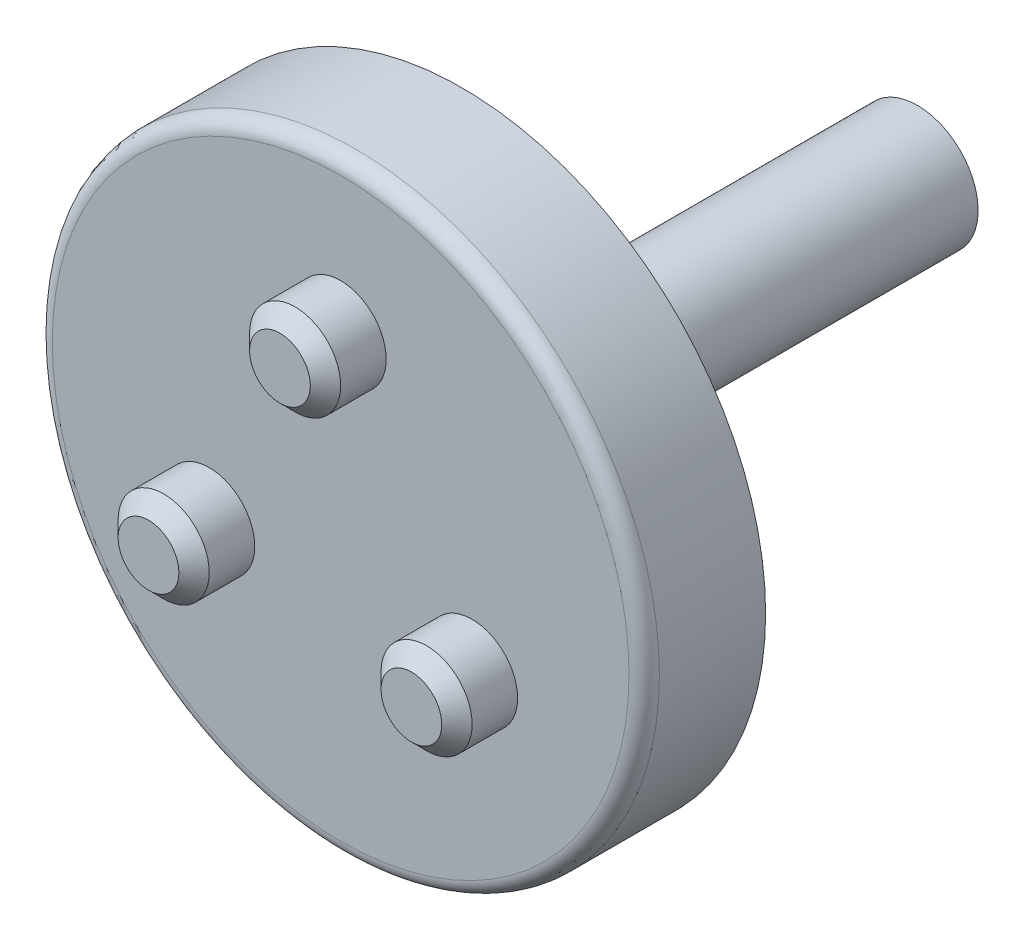
ISO-10303-21;
HEADER;
FILE_DESCRIPTION(('STEP AP214'),'2;1');
FILE_NAME('part.step','',(''),(''),'','','');
FILE_SCHEMA(('AUTOMOTIVE_DESIGN { 1 0 10303 214 1 1 1 1 }'));
ENDSEC;
DATA;
#1=APPLICATION_CONTEXT('core data for automotive mechanical design processes');
#2=APPLICATION_PROTOCOL_DEFINITION('international standard','automotive_design',2000,#1);
#3=PRODUCT_CONTEXT('',#1,'mechanical');
#4=PRODUCT('Part','Part','',(#3));
#5=PRODUCT_RELATED_PRODUCT_CATEGORY('part','',(#4));
#6=PRODUCT_DEFINITION_FORMATION('','',#4);
#7=PRODUCT_DEFINITION_CONTEXT('part definition',#1,'design');
#8=PRODUCT_DEFINITION('design','',#6,#7);
#9=PRODUCT_DEFINITION_SHAPE('','',#8);
#10=(LENGTH_UNIT() NAMED_UNIT(*) SI_UNIT(.MILLI.,.METRE.));
#11=(NAMED_UNIT(*) PLANE_ANGLE_UNIT() SI_UNIT($,.RADIAN.));
#12=(NAMED_UNIT(*) SI_UNIT($,.STERADIAN.) SOLID_ANGLE_UNIT());
#13=UNCERTAINTY_MEASURE_WITH_UNIT(LENGTH_MEASURE(1.E-05),#10,'distance_accuracy_value','');
#14=(GEOMETRIC_REPRESENTATION_CONTEXT(3) GLOBAL_UNCERTAINTY_ASSIGNED_CONTEXT((#13)) GLOBAL_UNIT_ASSIGNED_CONTEXT((#10,
#11,#12)) REPRESENTATION_CONTEXT('',''));
#15=CARTESIAN_POINT('',(0.,0.,0.));
#16=DIRECTION('',(0.,0.,1.));
#17=DIRECTION('',(1.,0.,0.));
#18=AXIS2_PLACEMENT_3D('',#15,#16,#17);
#19=CARTESIAN_POINT('',(0.,0.,-150.));
#20=DIRECTION('',(0.,0.,1.));
#21=DIRECTION('',(1.,0.,0.));
#22=AXIS2_PLACEMENT_3D('',#19,#20,#21);
#23=CYLINDRICAL_SURFACE('',#22,20.);
#24=CARTESIAN_POINT('',(0.,0.,-150.));
#25=DIRECTION('',(0.,0.,-1.));
#26=DIRECTION('',(-1.,0.,0.));
#27=AXIS2_PLACEMENT_3D('',#24,#25,#26);
#28=CIRCLE('',#27,20.);
#29=CARTESIAN_POINT('',(-20.,0.,-150.));
#30=VERTEX_POINT('',#29);
#31=EDGE_CURVE('E11',#30,#30,#28,.T.);
#32=ORIENTED_EDGE('',*,*,#31,.F.);
#33=EDGE_LOOP('',(#32));
#34=FACE_BOUND('',#33,.T.);
#35=CARTESIAN_POINT('',(0.,0.,0.));
#36=DIRECTION('',(0.,0.,-1.));
#37=DIRECTION('',(-1.,0.,0.));
#38=AXIS2_PLACEMENT_3D('',#35,#36,#37);
#39=CIRCLE('',#38,20.);
#40=CARTESIAN_POINT('',(-20.,0.,0.));
#41=VERTEX_POINT('',#40);
#42=EDGE_CURVE('E47',#41,#41,#39,.T.);
#43=ORIENTED_EDGE('',*,*,#42,.T.);
#44=EDGE_LOOP('',(#43));
#45=FACE_BOUND('',#44,.T.);
#46=ADVANCED_FACE('F44',(#34,#45),#23,.T.);
#47=CARTESIAN_POINT('',(0.,0.,-150.));
#48=DIRECTION('',(0.,0.,-1.));
#49=DIRECTION('',(-1.,0.,0.));
#50=AXIS2_PLACEMENT_3D('',#47,#48,#49);
#51=PLANE('',#50);
#52=ORIENTED_EDGE('',*,*,#31,.T.);
#53=EDGE_LOOP('',(#52));
#54=FACE_BOUND('',#53,.T.);
#55=ADVANCED_FACE('F59',(#54),#51,.T.);
#56=CARTESIAN_POINT('',(0.,0.,0.));
#57=DIRECTION('',(0.,0.,-1.));
#58=DIRECTION('',(-1.,0.,0.));
#59=AXIS2_PLACEMENT_3D('',#56,#57,#58);
#60=PLANE('',#59);
#61=ORIENTED_EDGE('',*,*,#42,.F.);
#62=EDGE_LOOP('',(#61));
#63=FACE_BOUND('',#62,.T.);
#64=ADVANCED_FACE('F57',(#63),#60,.F.);
#65=CLOSED_SHELL('',(#46,#55,#64));
#66=MANIFOLD_SOLID_BREP('B2',#65);
#67=CARTESIAN_POINT('',(0.,0.,40.));
#68=DIRECTION('',(0.,0.,-1.));
#69=DIRECTION('',(-1.,0.,0.));
#70=AXIS2_PLACEMENT_3D('',#67,#68,#69);
#71=CYLINDRICAL_SURFACE('',#70,100.);
#72=CARTESIAN_POINT('',(0.,0.,35.));
#73=DIRECTION('',(0.,0.,1.));
#74=DIRECTION('',(1.,0.,0.));
#75=AXIS2_PLACEMENT_3D('',#72,#73,#74);
#76=CIRCLE('',#75,100.);
#77=CARTESIAN_POINT('',(100.,0.,35.));
#78=VERTEX_POINT('',#77);
#79=EDGE_CURVE('E43',#78,#78,#76,.F.);
#80=ORIENTED_EDGE('',*,*,#79,.T.);
#81=EDGE_LOOP('',(#80));
#82=FACE_BOUND('',#81,.T.);
#83=CARTESIAN_POINT('',(0.,0.,0.));
#84=DIRECTION('',(0.,0.,1.));
#85=DIRECTION('',(1.,0.,0.));
#86=AXIS2_PLACEMENT_3D('',#83,#84,#85);
#87=CIRCLE('',#86,100.);
#88=CARTESIAN_POINT('',(100.,0.,0.));
#89=VERTEX_POINT('',#88);
#90=EDGE_CURVE('E116',#89,#89,#87,.T.);
#91=ORIENTED_EDGE('',*,*,#90,.T.);
#92=EDGE_LOOP('',(#91));
#93=FACE_BOUND('',#92,.T.);
#94=ADVANCED_FACE('F84',(#82,#93),#71,.T.);
#95=CARTESIAN_POINT('',(0.,0.,40.));
#96=DIRECTION('',(0.,0.,1.));
#97=DIRECTION('',(1.,0.,0.));
#98=AXIS2_PLACEMENT_3D('',#95,#96,#97);
#99=PLANE('',#98);
#100=CARTESIAN_POINT('',(0.,0.,40.));
#101=DIRECTION('',(0.,0.,1.));
#102=DIRECTION('',(1.,0.,0.));
#103=AXIS2_PLACEMENT_3D('',#100,#101,#102);
#104=CIRCLE('',#103,95.);
#105=CARTESIAN_POINT('',(95.,0.,40.));
#106=VERTEX_POINT('',#105);
#107=EDGE_CURVE('E91',#106,#106,#104,.T.);
#108=ORIENTED_EDGE('',*,*,#107,.T.);
#109=EDGE_LOOP('',(#108));
#110=FACE_BOUND('',#109,.T.);
#111=CARTESIAN_POINT('',(-43.3012701892219,-25.,40.));
#112=DIRECTION('',(0.,0.,1.));
#113=DIRECTION('',(1.,0.,0.));
#114=AXIS2_PLACEMENT_3D('',#111,#112,#113);
#115=CIRCLE('',#114,15.0000000000005);
#116=CARTESIAN_POINT('',(-28.3012701892215,-25.,40.));
#117=VERTEX_POINT('',#116);
#118=EDGE_CURVE('E125',#117,#117,#115,.T.);
#119=ORIENTED_EDGE('',*,*,#118,.F.);
#120=EDGE_LOOP('',(#119));
#121=FACE_BOUND('',#120,.T.);
#122=CARTESIAN_POINT('',(43.3012701892219,-25.,40.));
#123=DIRECTION('',(0.,0.,1.));
#124=DIRECTION('',(1.,0.,0.));
#125=AXIS2_PLACEMENT_3D('',#122,#123,#124);
#126=CIRCLE('',#125,15.0000000000002);
#127=CARTESIAN_POINT('',(58.3012701892221,-25.,40.));
#128=VERTEX_POINT('',#127);
#129=EDGE_CURVE('E122',#128,#128,#126,.T.);
#130=ORIENTED_EDGE('',*,*,#129,.F.);
#131=EDGE_LOOP('',(#130));
#132=FACE_BOUND('',#131,.T.);
#133=CARTESIAN_POINT('',(0.,50.,40.));
#134=DIRECTION('',(0.,0.,1.));
#135=DIRECTION('',(1.,0.,0.));
#136=AXIS2_PLACEMENT_3D('',#133,#134,#135);
#137=CIRCLE('',#136,15.);
#138=CARTESIAN_POINT('',(15.,50.,40.));
#139=VERTEX_POINT('',#138);
#140=EDGE_CURVE('E119',#139,#139,#137,.T.);
#141=ORIENTED_EDGE('',*,*,#140,.F.);
#142=EDGE_LOOP('',(#141));
#143=FACE_BOUND('',#142,.T.);
#144=ADVANCED_FACE('F131',(#110,#121,#132,#143),#99,.T.);
#145=CARTESIAN_POINT('',(0.,0.,0.));
#146=DIRECTION('',(0.,0.,1.));
#147=DIRECTION('',(1.,0.,0.));
#148=AXIS2_PLACEMENT_3D('',#145,#146,#147);
#149=PLANE('',#148);
#150=ORIENTED_EDGE('',*,*,#90,.F.);
#151=EDGE_LOOP('',(#150));
#152=FACE_BOUND('',#151,.T.);
#153=ADVANCED_FACE('F134',(#152),#149,.F.);
#154=CARTESIAN_POINT('',(0.,50.,60.));
#155=DIRECTION('',(0.,0.,-1.));
#156=DIRECTION('',(-1.,0.,0.));
#157=AXIS2_PLACEMENT_3D('',#154,#155,#156);
#158=CYLINDRICAL_SURFACE('',#157,15.);
#159=CARTESIAN_POINT('',(0.,50.,55.));
#160=DIRECTION('',(0.,0.,1.));
#161=DIRECTION('',(1.,0.,0.));
#162=AXIS2_PLACEMENT_3D('',#159,#160,#161);
#163=CIRCLE('',#162,15.);
#164=CARTESIAN_POINT('',(15.,50.,55.));
#165=VERTEX_POINT('',#164);
#166=EDGE_CURVE('E95',#165,#165,#163,.F.);
#167=ORIENTED_EDGE('',*,*,#166,.T.);
#168=EDGE_LOOP('',(#167));
#169=FACE_BOUND('',#168,.T.);
#170=ORIENTED_EDGE('',*,*,#140,.T.);
#171=EDGE_LOOP('',(#170));
#172=FACE_BOUND('',#171,.T.);
#173=ADVANCED_FACE('F140',(#169,#172),#158,.T.);
#174=CARTESIAN_POINT('',(0.,50.,60.));
#175=DIRECTION('',(0.,0.,1.));
#176=DIRECTION('',(1.,0.,0.));
#177=AXIS2_PLACEMENT_3D('',#174,#175,#176);
#178=PLANE('',#177);
#179=CARTESIAN_POINT('',(0.,50.,60.));
#180=DIRECTION('',(0.,0.,1.));
#181=DIRECTION('',(1.,0.,0.));
#182=AXIS2_PLACEMENT_3D('',#179,#180,#181);
#183=CIRCLE('',#182,9.99999999999998);
#184=CARTESIAN_POINT('',(9.99999999999999,50.,60.));
#185=VERTEX_POINT('',#184);
#186=EDGE_CURVE('E99',#185,#185,#183,.T.);
#187=ORIENTED_EDGE('',*,*,#186,.T.);
#188=EDGE_LOOP('',(#187));
#189=FACE_BOUND('',#188,.T.);
#190=ADVANCED_FACE('F142',(#189),#178,.T.);
#191=CARTESIAN_POINT('',(43.3012701892219,-25.,60.));
#192=DIRECTION('',(0.,0.,-1.));
#193=DIRECTION('',(-1.,0.,0.));
#194=AXIS2_PLACEMENT_3D('',#191,#192,#193);
#195=CYLINDRICAL_SURFACE('',#194,15.0000000000002);
#196=CARTESIAN_POINT('',(43.3012701892219,-25.,54.9999999999999));
#197=DIRECTION('',(0.,0.,1.));
#198=DIRECTION('',(1.,0.,0.));
#199=AXIS2_PLACEMENT_3D('',#196,#197,#198);
#200=CIRCLE('',#199,15.0000000000002);
#201=CARTESIAN_POINT('',(58.3012701892221,-25.,54.9999999999999));
#202=VERTEX_POINT('',#201);
#203=EDGE_CURVE('E104',#202,#202,#200,.F.);
#204=ORIENTED_EDGE('',*,*,#203,.T.);
#205=EDGE_LOOP('',(#204));
#206=FACE_BOUND('',#205,.T.);
#207=ORIENTED_EDGE('',*,*,#129,.T.);
#208=EDGE_LOOP('',(#207));
#209=FACE_BOUND('',#208,.T.);
#210=ADVANCED_FACE('F149',(#206,#209),#195,.T.);
#211=CARTESIAN_POINT('',(43.3012701892219,-25.,60.));
#212=DIRECTION('',(0.,0.,1.));
#213=DIRECTION('',(1.,0.,0.));
#214=AXIS2_PLACEMENT_3D('',#211,#212,#213);
#215=PLANE('',#214);
#216=CARTESIAN_POINT('',(43.3012701892219,-25.,60.));
#217=DIRECTION('',(0.,0.,1.));
#218=DIRECTION('',(1.,0.,0.));
#219=AXIS2_PLACEMENT_3D('',#216,#217,#218);
#220=CIRCLE('',#219,10.0000000000001);
#221=CARTESIAN_POINT('',(53.3012701892221,-25.,60.));
#222=VERTEX_POINT('',#221);
#223=EDGE_CURVE('E107',#222,#222,#220,.T.);
#224=ORIENTED_EDGE('',*,*,#223,.T.);
#225=EDGE_LOOP('',(#224));
#226=FACE_BOUND('',#225,.T.);
#227=ADVANCED_FACE('F226',(#226),#215,.T.);
#228=CARTESIAN_POINT('',(-43.3012701892219,-25.,60.));
#229=DIRECTION('',(0.,0.,-1.));
#230=DIRECTION('',(-1.,0.,0.));
#231=AXIS2_PLACEMENT_3D('',#228,#229,#230);
#232=CYLINDRICAL_SURFACE('',#231,15.0000000000005);
#233=CARTESIAN_POINT('',(-43.3012701892219,-25.,55.));
#234=DIRECTION('',(0.,0.,1.));
#235=DIRECTION('',(1.,0.,0.));
#236=AXIS2_PLACEMENT_3D('',#233,#234,#235);
#237=CIRCLE('',#236,15.0000000000005);
#238=CARTESIAN_POINT('',(-28.3012701892215,-25.,55.));
#239=VERTEX_POINT('',#238);
#240=EDGE_CURVE('E110',#239,#239,#237,.F.);
#241=ORIENTED_EDGE('',*,*,#240,.T.);
#242=EDGE_LOOP('',(#241));
#243=FACE_BOUND('',#242,.T.);
#244=ORIENTED_EDGE('',*,*,#118,.T.);
#245=EDGE_LOOP('',(#244));
#246=FACE_BOUND('',#245,.T.);
#247=ADVANCED_FACE('F129',(#243,#246),#232,.T.);
#248=CARTESIAN_POINT('',(-43.3012701892219,-25.,60.));
#249=DIRECTION('',(0.,0.,1.));
#250=DIRECTION('',(1.,0.,0.));
#251=AXIS2_PLACEMENT_3D('',#248,#249,#250);
#252=PLANE('',#251);
#253=CARTESIAN_POINT('',(-43.3012701892219,-25.,60.));
#254=DIRECTION('',(0.,0.,1.));
#255=DIRECTION('',(1.,0.,0.));
#256=AXIS2_PLACEMENT_3D('',#253,#254,#255);
#257=CIRCLE('',#256,10.0000000000005);
#258=CARTESIAN_POINT('',(-33.3012701892215,-25.,60.));
#259=VERTEX_POINT('',#258);
#260=EDGE_CURVE('E113',#259,#259,#257,.T.);
#261=ORIENTED_EDGE('',*,*,#260,.T.);
#262=EDGE_LOOP('',(#261));
#263=FACE_BOUND('',#262,.T.);
#264=ADVANCED_FACE('F164',(#263),#252,.T.);
#265=CARTESIAN_POINT('',(-43.3012701892219,-25.,60.));
#266=DIRECTION('',(0.,0.,-1.));
#267=DIRECTION('',(-1.,0.,0.));
#268=AXIS2_PLACEMENT_3D('',#265,#266,#267);
#269=CONICAL_SURFACE('',#268,10.0000000000005,0.785398163397446);
#270=ORIENTED_EDGE('',*,*,#240,.F.);
#271=EDGE_LOOP('',(#270));
#272=FACE_BOUND('',#271,.T.);
#273=ORIENTED_EDGE('',*,*,#260,.F.);
#274=EDGE_LOOP('',(#273));
#275=FACE_BOUND('',#274,.T.);
#276=ADVANCED_FACE('F160',(#272,#275),#269,.T.);
#277=CARTESIAN_POINT('',(43.3012701892219,-25.,60.));
#278=DIRECTION('',(0.,0.,-1.));
#279=DIRECTION('',(-1.,0.,0.));
#280=AXIS2_PLACEMENT_3D('',#277,#278,#279);
#281=CONICAL_SURFACE('',#280,10.0000000000001,0.785398163397449);
#282=ORIENTED_EDGE('',*,*,#203,.F.);
#283=EDGE_LOOP('',(#282));
#284=FACE_BOUND('',#283,.T.);
#285=ORIENTED_EDGE('',*,*,#223,.F.);
#286=EDGE_LOOP('',(#285));
#287=FACE_BOUND('',#286,.T.);
#288=ADVANCED_FACE('F163',(#284,#287),#281,.T.);
#289=CARTESIAN_POINT('',(0.,50.,60.));
#290=DIRECTION('',(0.,0.,-1.));
#291=DIRECTION('',(-1.,0.,0.));
#292=AXIS2_PLACEMENT_3D('',#289,#290,#291);
#293=CONICAL_SURFACE('',#292,9.99999999999998,0.785398163397449);
#294=ORIENTED_EDGE('',*,*,#166,.F.);
#295=EDGE_LOOP('',(#294));
#296=FACE_BOUND('',#295,.T.);
#297=ORIENTED_EDGE('',*,*,#186,.F.);
#298=EDGE_LOOP('',(#297));
#299=FACE_BOUND('',#298,.T.);
#300=ADVANCED_FACE('F167',(#296,#299),#293,.T.);
#301=CARTESIAN_POINT('',(0.,0.,35.));
#302=DIRECTION('',(0.,0.,1.));
#303=DIRECTION('',(1.,0.,0.));
#304=AXIS2_PLACEMENT_3D('',#301,#302,#303);
#305=TOROIDAL_SURFACE('',#304,95.,5.);
#306=ORIENTED_EDGE('',*,*,#79,.F.);
#307=EDGE_LOOP('',(#306));
#308=FACE_BOUND('',#307,.T.);
#309=ORIENTED_EDGE('',*,*,#107,.F.);
#310=EDGE_LOOP('',(#309));
#311=FACE_BOUND('',#310,.T.);
#312=ADVANCED_FACE('F86',(#308,#311),#305,.T.);
#313=CLOSED_SHELL('',(#94,#144,#153,#173,#190,#210,#227,#247,#264,#276,#288,#300,#312));
#314=MANIFOLD_SOLID_BREP('B6',#313);
#315=ADVANCED_BREP_SHAPE_REPRESENTATION('',(#18,#66,#314),#14);
#316=SHAPE_DEFINITION_REPRESENTATION(#9,#315);
ENDSEC;
END-ISO-10303-21;
